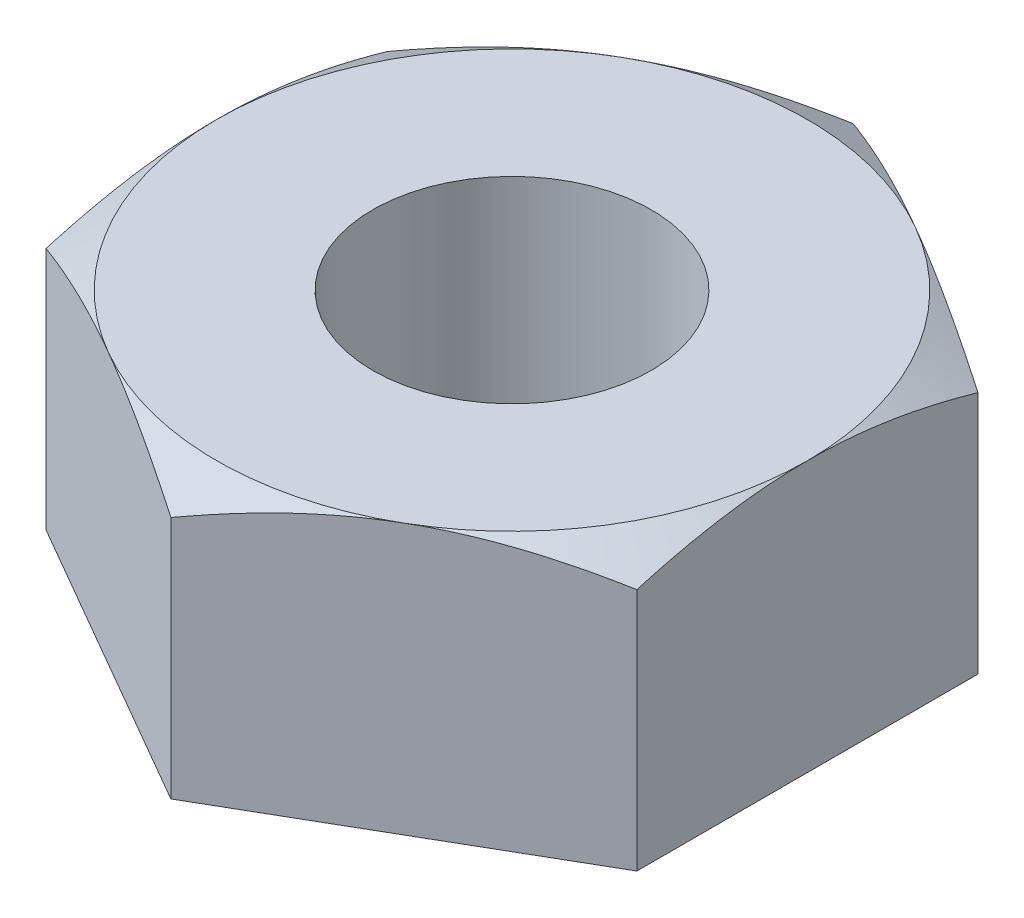
ISO-10303-21;
HEADER;
FILE_DESCRIPTION(('STEP AP214'),'2;1');
FILE_NAME('part.step','',(''),(''),'','','');
FILE_SCHEMA(('AUTOMOTIVE_DESIGN { 1 0 10303 214 1 1 1 1 }'));
ENDSEC;
DATA;
#1=APPLICATION_CONTEXT('core data for automotive mechanical design processes');
#2=APPLICATION_PROTOCOL_DEFINITION('international standard','automotive_design',2000,#1);
#3=PRODUCT_CONTEXT('',#1,'mechanical');
#4=PRODUCT('Part','Part','',(#3));
#5=PRODUCT_RELATED_PRODUCT_CATEGORY('part','',(#4));
#6=PRODUCT_DEFINITION_FORMATION('','',#4);
#7=PRODUCT_DEFINITION_CONTEXT('part definition',#1,'design');
#8=PRODUCT_DEFINITION('design','',#6,#7);
#9=PRODUCT_DEFINITION_SHAPE('','',#8);
#10=(LENGTH_UNIT() NAMED_UNIT(*) SI_UNIT(.MILLI.,.METRE.));
#11=(NAMED_UNIT(*) PLANE_ANGLE_UNIT() SI_UNIT($,.RADIAN.));
#12=(NAMED_UNIT(*) SI_UNIT($,.STERADIAN.) SOLID_ANGLE_UNIT());
#13=UNCERTAINTY_MEASURE_WITH_UNIT(LENGTH_MEASURE(1.E-05),#10,'distance_accuracy_value','');
#14=(GEOMETRIC_REPRESENTATION_CONTEXT(3) GLOBAL_UNCERTAINTY_ASSIGNED_CONTEXT((#13)) GLOBAL_UNIT_ASSIGNED_CONTEXT((#10,
#11,#12)) REPRESENTATION_CONTEXT('',''));
#15=CARTESIAN_POINT('',(0.,0.,0.));
#16=DIRECTION('',(0.,0.,1.));
#17=DIRECTION('',(1.,0.,0.));
#18=AXIS2_PLACEMENT_3D('',#15,#16,#17);
#19=CARTESIAN_POINT('',(3.5,-3.2,-2.02072594216369));
#20=DIRECTION('',(0.5,0.,-0.866025403784439));
#21=DIRECTION('',(-0.866025403784439,0.,-0.5));
#22=AXIS2_PLACEMENT_3D('',#19,#20,#21);
#23=PLANE('',#22);
#24=DIRECTION('',(0.,1.,0.));
#25=VECTOR('',#24,1.);
#26=CARTESIAN_POINT('',(0.,-3.2,-4.04145188432738));
#27=LINE('',#26,#25);
#28=CARTESIAN_POINT('',(0.,-3.2,-4.04145188432738));
#29=VERTEX_POINT('',#28);
#30=CARTESIAN_POINT('',(0.,-0.312607391169639,-4.04145188432738));
#31=VERTEX_POINT('',#30);
#32=EDGE_CURVE('E142',#29,#31,#27,.T.);
#33=ORIENTED_EDGE('',*,*,#32,.T.);
#34=CARTESIAN_POINT('',(-0.000199999999999465,-0.312674060693367,-4.04156735438122));
#35=CARTESIAN_POINT('',(0.15360717845245,-0.26138578898998,-3.9527667384984));
#36=CARTESIAN_POINT('',(0.308742010834424,-0.214740953816194,-3.86319960126198));
#37=CARTESIAN_POINT('',(0.621698006576781,-0.133321875533347,-3.68251437287562));
#38=CARTESIAN_POINT('',(0.779524730787496,-0.0985764355845603,-3.59139307116725));
#39=CARTESIAN_POINT('',(1.09322221038013,-0.0444900271828356,-3.41027974688034));
#40=CARTESIAN_POINT('',(1.24904469916069,-0.0247890862603811,-3.32031559103708));
#41=CARTESIAN_POINT('',(1.56142288720537,-0.00127013273725403,-3.13996396008052));
#42=CARTESIAN_POINT('',(1.71797745103423,0.00256735545443508,-3.04957714051106));
#43=CARTESIAN_POINT('',(2.01050921992099,-0.00541530187697733,-2.88068384499777));
#44=CARTESIAN_POINT('',(2.1465302124579,-0.0152754340696067,-2.80215208834115));
#45=CARTESIAN_POINT('',(2.41768602028899,-0.0465264668994027,-2.64560020969754));
#46=CARTESIAN_POINT('',(2.55281989768468,-0.0679280432857969,-2.5675806292065));
#47=CARTESIAN_POINT('',(2.82453479240518,-0.121430407880575,-2.41070596159679));
#48=CARTESIAN_POINT('',(2.96108141927833,-0.153757994445084,-2.33187072981464));
#49=CARTESIAN_POINT('',(3.2321380929445,-0.227128933807991,-2.17537608630783));
#50=CARTESIAN_POINT('',(3.36665161246854,-0.268155046569863,-2.09771466960098));
#51=CARTESIAN_POINT('',(3.5002,-0.312674060693367,-2.02061047210985));
#52=B_SPLINE_CURVE_WITH_KNOTS('',3,(#34,#35,#36,#37,#38,#39,#40,#41,#42,#43,#44,#45,#46,#47,#48,
#49,#50,#51),.UNSPECIFIED.,.F.,.F.,(4,2,2,2,2,2,2,2,4),(0.,0.554793832886253,1.11092123814983,
1.65328467083218,2.19498204478403,2.6666513085086,3.13875761298267,3.62133612600509,
4.10296698719187),.UNSPECIFIED.);
#53=CARTESIAN_POINT('',(1.75,0.,-3.03108891324554));
#54=VERTEX_POINT('',#53);
#55=EDGE_CURVE('E58',#31,#54,#52,.T.);
#56=ORIENTED_EDGE('',*,*,#55,.T.);
#57=CARTESIAN_POINT('',(3.5,-0.312607391169639,-2.02072594216369));
#58=VERTEX_POINT('',#57);
#59=EDGE_CURVE('E221',#54,#58,#52,.T.);
#60=ORIENTED_EDGE('',*,*,#59,.T.);
#61=DIRECTION('',(0.,1.,0.));
#62=VECTOR('',#61,1.);
#63=CARTESIAN_POINT('',(3.5,-3.2,-2.02072594216369));
#64=LINE('',#63,#62);
#65=CARTESIAN_POINT('',(3.5,-3.2,-2.02072594216369));
#66=VERTEX_POINT('',#65);
#67=EDGE_CURVE('E134',#66,#58,#64,.T.);
#68=ORIENTED_EDGE('',*,*,#67,.F.);
#69=DIRECTION('',(-0.866025403784439,0.,-0.5));
#70=VECTOR('',#69,1.);
#71=CARTESIAN_POINT('',(3.5,-3.2,-2.02072594216369));
#72=LINE('',#71,#70);
#73=EDGE_CURVE('E349',#66,#29,#72,.T.);
#74=ORIENTED_EDGE('',*,*,#73,.T.);
#75=EDGE_LOOP('',(#33,#56,#60,#68,#74));
#76=FACE_BOUND('',#75,.T.);
#77=ADVANCED_FACE('F34',(#76),#23,.T.);
#78=CARTESIAN_POINT('',(3.5,-3.2,2.02072594216369));
#79=DIRECTION('',(1.,0.,0.));
#80=DIRECTION('',(0.,0.,-1.));
#81=AXIS2_PLACEMENT_3D('',#78,#79,#80);
#82=PLANE('',#81);
#83=ORIENTED_EDGE('',*,*,#67,.T.);
#84=CARTESIAN_POINT('',(3.5,-1.67484346858553,-5.35926299121405));
#85=CARTESIAN_POINT('',(3.5,-1.60058173692101,-5.20559319908841));
#86=CARTESIAN_POINT('',(3.5,-1.52705822833145,-5.05156008083375));
#87=CARTESIAN_POINT('',(3.5,-1.38190950344749,-4.7425707418071));
#88=CARTESIAN_POINT('',(3.5,-1.3102846158213,-4.58761436682436));
#89=CARTESIAN_POINT('',(3.5,-1.16897765517622,-4.27574500225542));
#90=CARTESIAN_POINT('',(3.5,-1.09930904568014,-4.11882589028191));
#91=CARTESIAN_POINT('',(3.5,-0.962964262242742,-3.80369792903855));
#92=CARTESIAN_POINT('',(3.5,-0.896287932319501,-3.64548914750595));
#93=CARTESIAN_POINT('',(3.5,-0.765931819095052,-3.32556618401855));
#94=CARTESIAN_POINT('',(3.5,-0.702298873688851,-3.16383281219923));
#95=CARTESIAN_POINT('',(3.5,-0.580016702089481,-2.83845840945597));
#96=CARTESIAN_POINT('',(3.5,-0.521368030370681,-2.67481716858825));
#97=CARTESIAN_POINT('',(3.5,-0.410630279877014,-2.34570278472049));
#98=CARTESIAN_POINT('',(3.5,-0.358527255435851,-2.18023438248742));
#99=CARTESIAN_POINT('',(3.5,-0.262572936976438,-1.84694522806369));
#100=CARTESIAN_POINT('',(3.5,-0.218719033467153,-1.6791252378753));
#101=CARTESIAN_POINT('',(3.5,-0.141391945584784,-1.34101828610925));
#102=CARTESIAN_POINT('',(3.5,-0.10792152521197,-1.17073068027693));
#103=CARTESIAN_POINT('',(3.5,-0.0536149564320492,-0.828102385138483));
#104=CARTESIAN_POINT('',(3.5,-0.0327788191952357,-0.655761694017301));
#105=CARTESIAN_POINT('',(3.5,-0.00558408650575642,-0.311020490924449));
#106=CARTESIAN_POINT('',(3.5,0.000866163165911391,-0.13862739720726));
#107=CARTESIAN_POINT('',(3.5,-0.00105355807794594,0.206038074906534));
#108=CARTESIAN_POINT('',(3.5,-0.00941968196343153,0.378310473023178));
#109=CARTESIAN_POINT('',(3.5,-0.0357688927868914,0.672490555822328));
#110=CARTESIAN_POINT('',(3.5,-0.0503206340384207,0.794722791084095));
#111=CARTESIAN_POINT('',(3.5,-0.0859367340533555,1.03824305430561));
#112=CARTESIAN_POINT('',(3.5,-0.107002119926141,1.15953093025888));
#113=CARTESIAN_POINT('',(3.5,-0.178863187081453,1.5218791477135));
#114=CARTESIAN_POINT('',(3.5,-0.238305275622011,1.76124104212634));
#115=CARTESIAN_POINT('',(3.5,-0.340826814402557,2.11940971387711));
#116=CARTESIAN_POINT('',(3.5,-0.377749699085187,2.2400834431635));
#117=CARTESIAN_POINT('',(3.5,-0.455249007699299,2.48017139213732));
#118=CARTESIAN_POINT('',(3.5,-0.495822911663555,2.59958641795617));
#119=CARTESIAN_POINT('',(3.5,-0.579779986782758,2.83665760451803));
#120=CARTESIAN_POINT('',(3.5,-0.623146060034321,2.95431988203488));
#121=CARTESIAN_POINT('',(3.5,-0.712423559566875,3.18873153508805));
#122=CARTESIAN_POINT('',(3.5,-0.75833601459296,3.30548051959469));
#123=CARTESIAN_POINT('',(3.5,-0.80527038072408,3.42180736613354));
#124=B_SPLINE_CURVE_WITH_KNOTS('',3,(#84,#85,#86,#87,#88,#89,#90,#91,#92,#93,#94,#95,#96,#97,
#98,#99,#100,#101,#102,#103,#104,#105,#106,#107,#108,#109,#110,#111,#112,#113,#114,#115,#116,
#117,#118,#119,#120,#121,#122,#123),.UNSPECIFIED.,.F.,.F.,(4,2,2,2,2,2,2,2,2,2,2,2,2,2,2,2,2,2,
2,4),(0.,0.512025318465737,1.02413870177436,1.53918270315241,2.05419982499223,2.57553975872798,
3.09693761309352,3.617205066104,4.13730766217536,4.65754858684363,5.1777899714696,
5.69470725122281,6.21149033452399,6.5805962322233,6.94976036239485,7.68863804939853,
8.0671962166048,8.44549507476763,8.82166461280103,9.19798724733415),.UNSPECIFIED.);
#125=CARTESIAN_POINT('',(3.5,0.,0.));
#126=VERTEX_POINT('',#125);
#127=EDGE_CURVE('E220',#58,#126,#124,.T.);
#128=ORIENTED_EDGE('',*,*,#127,.T.);
#129=CARTESIAN_POINT('',(3.5,-0.312607391169639,2.02072594216369));
#130=VERTEX_POINT('',#129);
#131=EDGE_CURVE('E214',#126,#130,#124,.T.);
#132=ORIENTED_EDGE('',*,*,#131,.T.);
#133=DIRECTION('',(0.,1.,0.));
#134=VECTOR('',#133,1.);
#135=CARTESIAN_POINT('',(3.5,-3.2,2.02072594216369));
#136=LINE('',#135,#134);
#137=CARTESIAN_POINT('',(3.5,-3.2,2.02072594216369));
#138=VERTEX_POINT('',#137);
#139=EDGE_CURVE('E131',#138,#130,#136,.T.);
#140=ORIENTED_EDGE('',*,*,#139,.F.);
#141=DIRECTION('',(0.,0.,-1.));
#142=VECTOR('',#141,1.);
#143=CARTESIAN_POINT('',(3.5,-3.2,2.02072594216369));
#144=LINE('',#143,#142);
#145=EDGE_CURVE('E144',#138,#66,#144,.T.);
#146=ORIENTED_EDGE('',*,*,#145,.T.);
#147=EDGE_LOOP('',(#83,#128,#132,#140,#146));
#148=FACE_BOUND('',#147,.T.);
#149=ADVANCED_FACE('F226',(#148),#82,.T.);
#150=CARTESIAN_POINT('',(0.,-3.2,4.04145188432738));
#151=DIRECTION('',(0.5,0.,0.866025403784439));
#152=DIRECTION('',(0.866025403784439,0.,-0.5));
#153=AXIS2_PLACEMENT_3D('',#150,#151,#152);
#154=PLANE('',#153);
#155=ORIENTED_EDGE('',*,*,#139,.T.);
#156=CARTESIAN_POINT('',(3.5002,-0.312674060693367,2.02061047210985));
#157=CARTESIAN_POINT('',(3.34639282154755,-0.26138578898998,2.10941108799267));
#158=CARTESIAN_POINT('',(3.19125798916558,-0.214740953816195,2.19897822522909));
#159=CARTESIAN_POINT('',(2.87830199342322,-0.133321875533347,2.37966345361545));
#160=CARTESIAN_POINT('',(2.72047526921251,-0.0985764355845607,2.47078475532382));
#161=CARTESIAN_POINT('',(2.40677778961987,-0.0444900271828359,2.65189807961074));
#162=CARTESIAN_POINT('',(2.25095530083931,-0.0247890862603814,2.74186223545399));
#163=CARTESIAN_POINT('',(1.93857711279463,-0.00127013273725443,2.92221386641056));
#164=CARTESIAN_POINT('',(1.78202254896577,0.00256735545443462,3.01260068598001));
#165=CARTESIAN_POINT('',(1.48949078007901,-0.00541530187697758,3.1814939814933));
#166=CARTESIAN_POINT('',(1.3534697875421,-0.0152754340696068,3.26002573814993));
#167=CARTESIAN_POINT('',(1.08231397971101,-0.0465264668994027,3.41657761679354));
#168=CARTESIAN_POINT('',(0.947180102315318,-0.0679280432857971,3.49459719728458));
#169=CARTESIAN_POINT('',(0.675465207594817,-0.121430407880575,3.65147186489429));
#170=CARTESIAN_POINT('',(0.538918580721665,-0.153757994445085,3.73030709667644));
#171=CARTESIAN_POINT('',(0.267861907055498,-0.227128933807991,3.88680174018324));
#172=CARTESIAN_POINT('',(0.133348387531463,-0.268155046569863,3.96446315689009));
#173=CARTESIAN_POINT('',(-0.000200000000000926,-0.312674060693367,4.04156735438122));
#174=B_SPLINE_CURVE_WITH_KNOTS('',3,(#156,#157,#158,#159,#160,#161,#162,#163,#164,#165,#166,
#167,#168,#169,#170,#171,#172,#173),.UNSPECIFIED.,.F.,.F.,(4,2,2,2,2,2,2,2,4),(0.,
0.554793832886253,1.11092123814983,1.65328467083218,2.19498204478403,2.6666513085086,
3.13875761298267,3.6213361260051,4.10296698719187),.UNSPECIFIED.);
#175=CARTESIAN_POINT('',(1.75,0.,3.03108891324554));
#176=VERTEX_POINT('',#175);
#177=EDGE_CURVE('E125',#130,#176,#174,.T.);
#178=ORIENTED_EDGE('',*,*,#177,.T.);
#179=CARTESIAN_POINT('',(0.,-0.312607391169639,4.04145188432738));
#180=VERTEX_POINT('',#179);
#181=EDGE_CURVE('E110',#176,#180,#174,.T.);
#182=ORIENTED_EDGE('',*,*,#181,.T.);
#183=DIRECTION('',(0.,1.,0.));
#184=VECTOR('',#183,1.);
#185=CARTESIAN_POINT('',(0.,-3.2,4.04145188432738));
#186=LINE('',#185,#184);
#187=CARTESIAN_POINT('',(0.,-3.2,4.04145188432738));
#188=VERTEX_POINT('',#187);
#189=EDGE_CURVE('E123',#188,#180,#186,.T.);
#190=ORIENTED_EDGE('',*,*,#189,.F.);
#191=DIRECTION('',(0.866025403784439,0.,-0.5));
#192=VECTOR('',#191,1.);
#193=CARTESIAN_POINT('',(0.,-3.2,4.04145188432738));
#194=LINE('',#193,#192);
#195=EDGE_CURVE('E148',#188,#138,#194,.T.);
#196=ORIENTED_EDGE('',*,*,#195,.T.);
#197=EDGE_LOOP('',(#155,#178,#182,#190,#196));
#198=FACE_BOUND('',#197,.T.);
#199=ADVANCED_FACE('F121',(#198),#154,.T.);
#200=CARTESIAN_POINT('',(-3.5,-3.2,2.02072594216369));
#201=DIRECTION('',(-0.5,0.,0.866025403784439));
#202=DIRECTION('',(0.866025403784439,0.,0.5));
#203=AXIS2_PLACEMENT_3D('',#200,#201,#202);
#204=PLANE('',#203);
#205=ORIENTED_EDGE('',*,*,#189,.T.);
#206=CARTESIAN_POINT('',(0.000199999999999057,-0.312674060693367,4.04156735438122));
#207=CARTESIAN_POINT('',(-0.15360717845245,-0.261385788989981,3.9527667384984));
#208=CARTESIAN_POINT('',(-0.308742010834425,-0.214740953816195,3.86319960126198));
#209=CARTESIAN_POINT('',(-0.621698006576781,-0.133321875533347,3.68251437287562));
#210=CARTESIAN_POINT('',(-0.779524730787496,-0.0985764355845604,3.59139307116725));
#211=CARTESIAN_POINT('',(-1.09322221038013,-0.0444900271828357,3.41027974688034));
#212=CARTESIAN_POINT('',(-1.24904469916069,-0.0247890862603815,3.32031559103708));
#213=CARTESIAN_POINT('',(-1.56142288720537,-0.00127013273725457,3.13996396008052));
#214=CARTESIAN_POINT('',(-1.71797745103423,0.00256735545443465,3.04957714051106));
#215=CARTESIAN_POINT('',(-2.01050921992099,-0.0054153018769776,2.88068384499778));
#216=CARTESIAN_POINT('',(-2.14653021245791,-0.015275434069607,2.80215208834115));
#217=CARTESIAN_POINT('',(-2.41768602028899,-0.0465264668994029,2.64560020969754));
#218=CARTESIAN_POINT('',(-2.55281989768468,-0.0679280432857971,2.5675806292065));
#219=CARTESIAN_POINT('',(-2.82453479240518,-0.121430407880575,2.41070596159679));
#220=CARTESIAN_POINT('',(-2.96108141927834,-0.153757994445085,2.33187072981464));
#221=CARTESIAN_POINT('',(-3.2321380929445,-0.227128933807991,2.17537608630783));
#222=CARTESIAN_POINT('',(-3.36665161246854,-0.268155046569863,2.09771466960098));
#223=CARTESIAN_POINT('',(-3.5002,-0.312674060693367,2.02061047210985));
#224=B_SPLINE_CURVE_WITH_KNOTS('',3,(#206,#207,#208,#209,#210,#211,#212,#213,#214,#215,#216,
#217,#218,#219,#220,#221,#222,#223),.UNSPECIFIED.,.F.,.F.,(4,2,2,2,2,2,2,2,4),(0.,
0.554793832886253,1.11092123814983,1.65328467083218,2.19498204478403,2.6666513085086,
3.13875761298267,3.62133612600509,4.10296698719187),.UNSPECIFIED.);
#225=CARTESIAN_POINT('',(-1.75,0.,3.03108891324554));
#226=VERTEX_POINT('',#225);
#227=EDGE_CURVE('E107',#180,#226,#224,.T.);
#228=ORIENTED_EDGE('',*,*,#227,.T.);
#229=CARTESIAN_POINT('',(-3.5,-0.312607391169639,2.02072594216369));
#230=VERTEX_POINT('',#229);
#231=EDGE_CURVE('E116',#226,#230,#224,.T.);
#232=ORIENTED_EDGE('',*,*,#231,.T.);
#233=DIRECTION('',(0.,1.,0.));
#234=VECTOR('',#233,1.);
#235=CARTESIAN_POINT('',(-3.5,-3.2,2.02072594216369));
#236=LINE('',#235,#234);
#237=CARTESIAN_POINT('',(-3.5,-3.2,2.02072594216369));
#238=VERTEX_POINT('',#237);
#239=EDGE_CURVE('E132',#238,#230,#236,.T.);
#240=ORIENTED_EDGE('',*,*,#239,.F.);
#241=DIRECTION('',(0.866025403784439,0.,0.5));
#242=VECTOR('',#241,1.);
#243=CARTESIAN_POINT('',(-3.5,-3.2,2.02072594216369));
#244=LINE('',#243,#242);
#245=EDGE_CURVE('E130',#238,#188,#244,.T.);
#246=ORIENTED_EDGE('',*,*,#245,.T.);
#247=EDGE_LOOP('',(#205,#228,#232,#240,#246));
#248=FACE_BOUND('',#247,.T.);
#249=ADVANCED_FACE('F128',(#248),#204,.T.);
#250=CARTESIAN_POINT('',(-3.5,-3.2,-2.02072594216369));
#251=DIRECTION('',(-1.,0.,0.));
#252=DIRECTION('',(0.,0.,1.));
#253=AXIS2_PLACEMENT_3D('',#250,#251,#252);
#254=PLANE('',#253);
#255=ORIENTED_EDGE('',*,*,#239,.T.);
#256=CARTESIAN_POINT('',(-3.5,-1.67484346858553,-5.35926299121405));
#257=CARTESIAN_POINT('',(-3.5,-1.60058173692101,-5.20559319908841));
#258=CARTESIAN_POINT('',(-3.5,-1.52705822833145,-5.05156008083375));
#259=CARTESIAN_POINT('',(-3.5,-1.38190950344749,-4.7425707418071));
#260=CARTESIAN_POINT('',(-3.5,-1.3102846158213,-4.58761436682436));
#261=CARTESIAN_POINT('',(-3.5,-1.16897765517622,-4.27574500225542));
#262=CARTESIAN_POINT('',(-3.5,-1.09930904568014,-4.11882589028191));
#263=CARTESIAN_POINT('',(-3.5,-0.962964262242742,-3.80369792903855));
#264=CARTESIAN_POINT('',(-3.5,-0.896287932319501,-3.64548914750595));
#265=CARTESIAN_POINT('',(-3.5,-0.765931819095052,-3.32556618401855));
#266=CARTESIAN_POINT('',(-3.5,-0.702298873688851,-3.16383281219923));
#267=CARTESIAN_POINT('',(-3.5,-0.580016702089481,-2.83845840945597));
#268=CARTESIAN_POINT('',(-3.5,-0.521368030370681,-2.67481716858825));
#269=CARTESIAN_POINT('',(-3.5,-0.410630279877014,-2.34570278472049));
#270=CARTESIAN_POINT('',(-3.5,-0.358527255435851,-2.18023438248742));
#271=CARTESIAN_POINT('',(-3.5,-0.262572936976438,-1.84694522806369));
#272=CARTESIAN_POINT('',(-3.5,-0.218719033467154,-1.6791252378753));
#273=CARTESIAN_POINT('',(-3.5,-0.141391945584784,-1.34101828610925));
#274=CARTESIAN_POINT('',(-3.5,-0.10792152521197,-1.17073068027693));
#275=CARTESIAN_POINT('',(-3.5,-0.0536149564320495,-0.828102385138484));
#276=CARTESIAN_POINT('',(-3.5,-0.032778819195236,-0.655761694017302));
#277=CARTESIAN_POINT('',(-3.5,-0.00558408650575659,-0.311020490924451));
#278=CARTESIAN_POINT('',(-3.5,0.000866163165911349,-0.138627397207261));
#279=CARTESIAN_POINT('',(-3.5,-0.0010535580779459,0.206038074906533));
#280=CARTESIAN_POINT('',(-3.5,-0.00941968196343153,0.378310473023177));
#281=CARTESIAN_POINT('',(-3.5,-0.0357688927868914,0.672490555822327));
#282=CARTESIAN_POINT('',(-3.5,-0.0503206340384207,0.794722791084095));
#283=CARTESIAN_POINT('',(-3.5,-0.0859367340533555,1.03824305430561));
#284=CARTESIAN_POINT('',(-3.5,-0.107002119926141,1.15953093025888));
#285=CARTESIAN_POINT('',(-3.5,-0.178863187081454,1.5218791477135));
#286=CARTESIAN_POINT('',(-3.5,-0.238305275622011,1.76124104212634));
#287=CARTESIAN_POINT('',(-3.5,-0.340826814402557,2.11940971387711));
#288=CARTESIAN_POINT('',(-3.5,-0.377749699085187,2.2400834431635));
#289=CARTESIAN_POINT('',(-3.5,-0.455249007699299,2.48017139213732));
#290=CARTESIAN_POINT('',(-3.5,-0.495822911663555,2.59958641795617));
#291=CARTESIAN_POINT('',(-3.5,-0.579779986782758,2.83665760451803));
#292=CARTESIAN_POINT('',(-3.5,-0.62314606003432,2.95431988203488));
#293=CARTESIAN_POINT('',(-3.5,-0.712423559566873,3.18873153508805));
#294=CARTESIAN_POINT('',(-3.5,-0.758336014592958,3.30548051959469));
#295=CARTESIAN_POINT('',(-3.5,-0.805270380724079,3.42180736613354));
#296=B_SPLINE_CURVE_WITH_KNOTS('',3,(#256,#257,#258,#259,#260,#261,#262,#263,#264,#265,#266,
#267,#268,#269,#270,#271,#272,#273,#274,#275,#276,#277,#278,#279,#280,#281,#282,#283,#284,#285,
#286,#287,#288,#289,#290,#291,#292,#293,#294,#295),.UNSPECIFIED.,.F.,.F.,(4,2,2,2,2,2,2,2,2,2,2,
2,2,2,2,2,2,2,2,4),(0.,0.512025318465737,1.02413870177436,1.53918270315241,2.05419982499223,
2.57553975872798,3.09693761309352,3.617205066104,4.13730766217536,4.65754858684363,
5.1777899714696,5.69470725122281,6.21149033452399,6.5805962322233,6.94976036239485,
7.68863804939853,8.0671962166048,8.44549507476763,8.82166461280102,9.19798724733414),.UNSPECIFIED.);
#297=CARTESIAN_POINT('',(-3.5,0.,0.));
#298=VERTEX_POINT('',#297);
#299=EDGE_CURVE('E176',#230,#298,#296,.F.);
#300=ORIENTED_EDGE('',*,*,#299,.T.);
#301=CARTESIAN_POINT('',(-3.5,-0.312607391169639,-2.02072594216369));
#302=VERTEX_POINT('',#301);
#303=EDGE_CURVE('E174',#298,#302,#296,.F.);
#304=ORIENTED_EDGE('',*,*,#303,.T.);
#305=DIRECTION('',(0.,1.,0.));
#306=VECTOR('',#305,1.);
#307=CARTESIAN_POINT('',(-3.5,-3.2,-2.02072594216369));
#308=LINE('',#307,#306);
#309=CARTESIAN_POINT('',(-3.5,-3.2,-2.02072594216369));
#310=VERTEX_POINT('',#309);
#311=EDGE_CURVE('E137',#310,#302,#308,.T.);
#312=ORIENTED_EDGE('',*,*,#311,.F.);
#313=DIRECTION('',(0.,0.,1.));
#314=VECTOR('',#313,1.);
#315=CARTESIAN_POINT('',(-3.5,-3.2,-2.02072594216369));
#316=LINE('',#315,#314);
#317=EDGE_CURVE('E352',#310,#238,#316,.T.);
#318=ORIENTED_EDGE('',*,*,#317,.T.);
#319=EDGE_LOOP('',(#255,#300,#304,#312,#318));
#320=FACE_BOUND('',#319,.T.);
#321=ADVANCED_FACE('F233',(#320),#254,.T.);
#322=CARTESIAN_POINT('',(0.,-3.2,-4.04145188432738));
#323=DIRECTION('',(-0.5,0.,-0.866025403784439));
#324=DIRECTION('',(-0.866025403784439,0.,0.5));
#325=AXIS2_PLACEMENT_3D('',#322,#323,#324);
#326=PLANE('',#325);
#327=ORIENTED_EDGE('',*,*,#311,.T.);
#328=CARTESIAN_POINT('',(-3.5002,-0.312674060693367,-2.02061047210985));
#329=CARTESIAN_POINT('',(-3.34639282154755,-0.26138578898998,-2.10941108799267));
#330=CARTESIAN_POINT('',(-3.19125798916558,-0.214740953816194,-2.19897822522909));
#331=CARTESIAN_POINT('',(-2.87830199342322,-0.133321875533347,-2.37966345361545));
#332=CARTESIAN_POINT('',(-2.72047526921251,-0.0985764355845601,-2.47078475532382));
#333=CARTESIAN_POINT('',(-2.40677778961987,-0.0444900271828353,-2.65189807961073));
#334=CARTESIAN_POINT('',(-2.25095530083931,-0.024789086260381,-2.74186223545399));
#335=CARTESIAN_POINT('',(-1.93857711279463,-0.00127013273725418,-2.92221386641056));
#336=CARTESIAN_POINT('',(-1.78202254896577,0.00256735545443479,-3.01260068598001));
#337=CARTESIAN_POINT('',(-1.48949078007901,-0.00541530187697744,-3.1814939814933));
#338=CARTESIAN_POINT('',(-1.3534697875421,-0.0152754340696066,-3.26002573814993));
#339=CARTESIAN_POINT('',(-1.08231397971101,-0.0465264668994025,-3.41657761679354));
#340=CARTESIAN_POINT('',(-0.947180102315318,-0.0679280432857969,-3.49459719728457));
#341=CARTESIAN_POINT('',(-0.675465207594817,-0.121430407880575,-3.65147186489429));
#342=CARTESIAN_POINT('',(-0.538918580721665,-0.153757994445084,-3.73030709667644));
#343=CARTESIAN_POINT('',(-0.267861907055498,-0.227128933807991,-3.88680174018324));
#344=CARTESIAN_POINT('',(-0.133348387531463,-0.268155046569863,-3.96446315689009));
#345=CARTESIAN_POINT('',(0.000200000000000733,-0.312674060693367,-4.04156735438122));
#346=B_SPLINE_CURVE_WITH_KNOTS('',3,(#328,#329,#330,#331,#332,#333,#334,#335,#336,#337,#338,
#339,#340,#341,#342,#343,#344,#345),.UNSPECIFIED.,.F.,.F.,(4,2,2,2,2,2,2,2,4),(0.,
0.554793832886253,1.11092123814983,1.65328467083218,2.19498204478403,2.6666513085086,
3.13875761298267,3.62133612600509,4.10296698719187),.UNSPECIFIED.);
#347=CARTESIAN_POINT('',(-1.75,0.,-3.03108891324554));
#348=VERTEX_POINT('',#347);
#349=EDGE_CURVE('E168',#302,#348,#346,.T.);
#350=ORIENTED_EDGE('',*,*,#349,.T.);
#351=EDGE_CURVE('E170',#348,#31,#346,.T.);
#352=ORIENTED_EDGE('',*,*,#351,.T.);
#353=ORIENTED_EDGE('',*,*,#32,.F.);
#354=DIRECTION('',(-0.866025403784439,0.,0.5));
#355=VECTOR('',#354,1.);
#356=CARTESIAN_POINT('',(0.,-3.2,-4.04145188432738));
#357=LINE('',#356,#355);
#358=EDGE_CURVE('E350',#29,#310,#357,.T.);
#359=ORIENTED_EDGE('',*,*,#358,.T.);
#360=EDGE_LOOP('',(#327,#350,#352,#353,#359));
#361=FACE_BOUND('',#360,.T.);
#362=ADVANCED_FACE('F169',(#361),#326,.T.);
#363=CARTESIAN_POINT('',(0.,-3.2,0.));
#364=DIRECTION('',(0.,1.,0.));
#365=DIRECTION('',(0.,0.,1.));
#366=AXIS2_PLACEMENT_3D('',#363,#364,#365);
#367=PLANE('',#366);
#368=CARTESIAN_POINT('',(0.,-3.2,0.));
#369=DIRECTION('',(0.,1.,0.));
#370=DIRECTION('',(0.,0.,1.));
#371=AXIS2_PLACEMENT_3D('',#368,#369,#370);
#372=CIRCLE('',#371,1.65);
#373=CARTESIAN_POINT('',(0.,-3.2,1.65));
#374=VERTEX_POINT('',#373);
#375=EDGE_CURVE('E343',#374,#374,#372,.T.);
#376=ORIENTED_EDGE('',*,*,#375,.T.);
#377=EDGE_LOOP('',(#376));
#378=FACE_BOUND('',#377,.T.);
#379=ORIENTED_EDGE('',*,*,#73,.F.);
#380=ORIENTED_EDGE('',*,*,#145,.F.);
#381=ORIENTED_EDGE('',*,*,#195,.F.);
#382=ORIENTED_EDGE('',*,*,#245,.F.);
#383=ORIENTED_EDGE('',*,*,#317,.F.);
#384=ORIENTED_EDGE('',*,*,#358,.F.);
#385=EDGE_LOOP('',(#379,#380,#381,#382,#383,#384));
#386=FACE_BOUND('',#385,.T.);
#387=ADVANCED_FACE('F197',(#378,#386),#367,.F.);
#388=CARTESIAN_POINT('',(0.,0.,0.));
#389=DIRECTION('',(0.,-1.,0.));
#390=DIRECTION('',(0.,0.,-1.));
#391=AXIS2_PLACEMENT_3D('',#388,#389,#390);
#392=CONICAL_SURFACE('',#391,3.5,1.0471975511966);
#393=CARTESIAN_POINT('',(0.,0.,0.));
#394=DIRECTION('',(0.,1.,0.));
#395=DIRECTION('',(0.,0.,1.));
#396=AXIS2_PLACEMENT_3D('',#393,#394,#395);
#397=CIRCLE('',#396,3.5);
#398=EDGE_CURVE('E38',#226,#176,#397,.T.);
#399=ORIENTED_EDGE('',*,*,#398,.F.);
#400=ORIENTED_EDGE('',*,*,#227,.F.);
#401=ORIENTED_EDGE('',*,*,#181,.F.);
#402=EDGE_LOOP('',(#399,#400,#401));
#403=FACE_BOUND('',#402,.T.);
#404=ADVANCED_FACE('F109',(#403),#392,.T.);
#405=EDGE_CURVE('E156',#298,#226,#397,.T.);
#406=ORIENTED_EDGE('',*,*,#405,.F.);
#407=ORIENTED_EDGE('',*,*,#299,.F.);
#408=ORIENTED_EDGE('',*,*,#231,.F.);
#409=EDGE_LOOP('',(#406,#407,#408));
#410=FACE_BOUND('',#409,.T.);
#411=ADVANCED_FACE('F195',(#410),#392,.T.);
#412=EDGE_CURVE('E158',#348,#298,#397,.T.);
#413=ORIENTED_EDGE('',*,*,#412,.F.);
#414=ORIENTED_EDGE('',*,*,#349,.F.);
#415=ORIENTED_EDGE('',*,*,#303,.F.);
#416=EDGE_LOOP('',(#413,#414,#415));
#417=FACE_BOUND('',#416,.T.);
#418=ADVANCED_FACE('F189',(#417),#392,.T.);
#419=ORIENTED_EDGE('',*,*,#351,.F.);
#420=EDGE_CURVE('E43',#54,#348,#397,.T.);
#421=ORIENTED_EDGE('',*,*,#420,.F.);
#422=ORIENTED_EDGE('',*,*,#55,.F.);
#423=EDGE_LOOP('',(#419,#421,#422));
#424=FACE_BOUND('',#423,.T.);
#425=ADVANCED_FACE('F194',(#424),#392,.T.);
#426=EDGE_CURVE('E11',#126,#54,#397,.T.);
#427=ORIENTED_EDGE('',*,*,#426,.F.);
#428=ORIENTED_EDGE('',*,*,#127,.F.);
#429=ORIENTED_EDGE('',*,*,#59,.F.);
#430=EDGE_LOOP('',(#427,#428,#429));
#431=FACE_BOUND('',#430,.T.);
#432=ADVANCED_FACE('F298',(#431),#392,.T.);
#433=CARTESIAN_POINT('',(0.,0.,0.));
#434=DIRECTION('',(0.,1.,0.));
#435=DIRECTION('',(0.,0.,1.));
#436=AXIS2_PLACEMENT_3D('',#433,#434,#435);
#437=CIRCLE('',#436,3.5);
#438=EDGE_CURVE('E50',#176,#126,#437,.T.);
#439=ORIENTED_EDGE('',*,*,#438,.F.);
#440=ORIENTED_EDGE('',*,*,#177,.F.);
#441=ORIENTED_EDGE('',*,*,#131,.F.);
#442=EDGE_LOOP('',(#439,#440,#441));
#443=FACE_BOUND('',#442,.T.);
#444=ADVANCED_FACE('F276',(#443),#392,.T.);
#445=CARTESIAN_POINT('',(0.,0.,0.));
#446=DIRECTION('',(0.,1.,0.));
#447=DIRECTION('',(0.,0.,1.));
#448=AXIS2_PLACEMENT_3D('',#445,#446,#447);
#449=PLANE('',#448);
#450=CARTESIAN_POINT('',(0.,0.,0.));
#451=DIRECTION('',(0.,1.,0.));
#452=DIRECTION('',(0.,0.,1.));
#453=AXIS2_PLACEMENT_3D('',#450,#451,#452);
#454=CIRCLE('',#453,1.65);
#455=CARTESIAN_POINT('',(0.,0.,1.65));
#456=VERTEX_POINT('',#455);
#457=EDGE_CURVE('E346',#456,#456,#454,.T.);
#458=ORIENTED_EDGE('',*,*,#457,.F.);
#459=EDGE_LOOP('',(#458));
#460=FACE_BOUND('',#459,.T.);
#461=ORIENTED_EDGE('',*,*,#398,.T.);
#462=ORIENTED_EDGE('',*,*,#438,.T.);
#463=ORIENTED_EDGE('',*,*,#426,.T.);
#464=ORIENTED_EDGE('',*,*,#420,.T.);
#465=ORIENTED_EDGE('',*,*,#412,.T.);
#466=ORIENTED_EDGE('',*,*,#405,.T.);
#467=EDGE_LOOP('',(#461,#462,#463,#464,#465,#466));
#468=FACE_BOUND('',#467,.T.);
#469=ADVANCED_FACE('F165',(#460,#468),#449,.T.);
#470=CARTESIAN_POINT('',(0.,0.,0.));
#471=DIRECTION('',(0.,1.,0.));
#472=DIRECTION('',(0.,0.,1.));
#473=AXIS2_PLACEMENT_3D('',#470,#471,#472);
#474=CYLINDRICAL_SURFACE('',#473,1.65);
#475=ORIENTED_EDGE('',*,*,#375,.F.);
#476=EDGE_LOOP('',(#475));
#477=FACE_BOUND('',#476,.T.);
#478=ORIENTED_EDGE('',*,*,#457,.T.);
#479=EDGE_LOOP('',(#478));
#480=FACE_BOUND('',#479,.T.);
#481=ADVANCED_FACE('F196',(#477,#480),#474,.F.);
#482=CLOSED_SHELL('',(#77,#149,#199,#249,#321,#362,#387,#404,#411,#418,#425,#432,#444,#469,#481));
#483=MANIFOLD_SOLID_BREP('B2',#482);
#484=ADVANCED_BREP_SHAPE_REPRESENTATION('',(#18,#483),#14);
#485=SHAPE_DEFINITION_REPRESENTATION(#9,#484);
ENDSEC;
END-ISO-10303-21;
